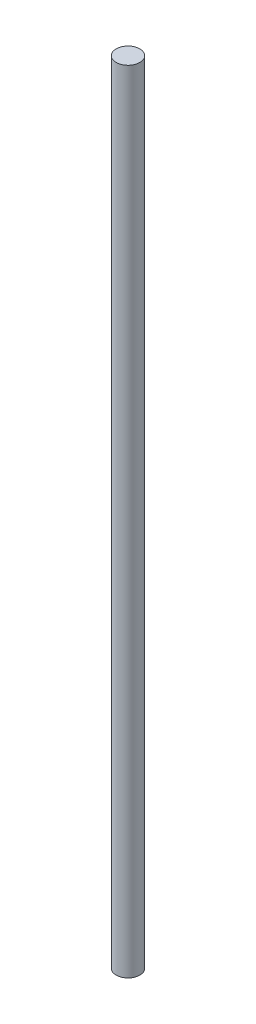
ISO-10303-21;
HEADER;
FILE_DESCRIPTION(('STEP AP214'),'2;1');
FILE_NAME('part.step','',(''),(''),'','','');
FILE_SCHEMA(('AUTOMOTIVE_DESIGN { 1 0 10303 214 1 1 1 1 }'));
ENDSEC;
DATA;
#1=APPLICATION_CONTEXT('core data for automotive mechanical design processes');
#2=APPLICATION_PROTOCOL_DEFINITION('international standard','automotive_design',2000,#1);
#3=PRODUCT_CONTEXT('',#1,'mechanical');
#4=PRODUCT('Part','Part','',(#3));
#5=PRODUCT_RELATED_PRODUCT_CATEGORY('part','',(#4));
#6=PRODUCT_DEFINITION_FORMATION('','',#4);
#7=PRODUCT_DEFINITION_CONTEXT('part definition',#1,'design');
#8=PRODUCT_DEFINITION('design','',#6,#7);
#9=PRODUCT_DEFINITION_SHAPE('','',#8);
#10=(LENGTH_UNIT() NAMED_UNIT(*) SI_UNIT(.MILLI.,.METRE.));
#11=(NAMED_UNIT(*) PLANE_ANGLE_UNIT() SI_UNIT($,.RADIAN.));
#12=(NAMED_UNIT(*) SI_UNIT($,.STERADIAN.) SOLID_ANGLE_UNIT());
#13=UNCERTAINTY_MEASURE_WITH_UNIT(LENGTH_MEASURE(1.E-05),#10,'distance_accuracy_value','');
#14=(GEOMETRIC_REPRESENTATION_CONTEXT(3) GLOBAL_UNCERTAINTY_ASSIGNED_CONTEXT((#13)) GLOBAL_UNIT_ASSIGNED_CONTEXT((#10,
#11,#12)) REPRESENTATION_CONTEXT('',''));
#15=CARTESIAN_POINT('',(0.,0.,0.));
#16=DIRECTION('',(0.,0.,1.));
#17=DIRECTION('',(1.,0.,0.));
#18=AXIS2_PLACEMENT_3D('',#15,#16,#17);
#19=CARTESIAN_POINT('',(0.,100.4,0.));
#20=DIRECTION('',(0.,-1.,0.));
#21=DIRECTION('',(0.,0.,-1.));
#22=AXIS2_PLACEMENT_3D('',#19,#20,#21);
#23=CYLINDRICAL_SURFACE('',#22,1.5);
#24=CARTESIAN_POINT('',(0.,100.4,0.));
#25=DIRECTION('',(0.,1.,0.));
#26=DIRECTION('',(0.,0.,1.));
#27=AXIS2_PLACEMENT_3D('',#24,#25,#26);
#28=CIRCLE('',#27,1.5);
#29=CARTESIAN_POINT('',(0.,100.4,1.5));
#30=VERTEX_POINT('',#29);
#31=EDGE_CURVE('E10',#30,#30,#28,.T.);
#32=ORIENTED_EDGE('',*,*,#31,.F.);
#33=EDGE_LOOP('',(#32));
#34=FACE_BOUND('',#33,.T.);
#35=CARTESIAN_POINT('',(0.,0.,0.));
#36=DIRECTION('',(0.,1.,0.));
#37=DIRECTION('',(0.,0.,1.));
#38=AXIS2_PLACEMENT_3D('',#35,#36,#37);
#39=CIRCLE('',#38,1.5);
#40=CARTESIAN_POINT('',(0.,0.,1.5));
#41=VERTEX_POINT('',#40);
#42=EDGE_CURVE('E40',#41,#41,#39,.T.);
#43=ORIENTED_EDGE('',*,*,#42,.T.);
#44=EDGE_LOOP('',(#43));
#45=FACE_BOUND('',#44,.T.);
#46=ADVANCED_FACE('F37',(#34,#45),#23,.T.);
#47=CARTESIAN_POINT('',(0.,100.4,0.));
#48=DIRECTION('',(0.,1.,0.));
#49=DIRECTION('',(0.,0.,1.));
#50=AXIS2_PLACEMENT_3D('',#47,#48,#49);
#51=PLANE('',#50);
#52=ORIENTED_EDGE('',*,*,#31,.T.);
#53=EDGE_LOOP('',(#52));
#54=FACE_BOUND('',#53,.T.);
#55=ADVANCED_FACE('F54',(#54),#51,.T.);
#56=CARTESIAN_POINT('',(0.,0.,0.));
#57=DIRECTION('',(0.,1.,0.));
#58=DIRECTION('',(0.,0.,1.));
#59=AXIS2_PLACEMENT_3D('',#56,#57,#58);
#60=PLANE('',#59);
#61=ORIENTED_EDGE('',*,*,#42,.F.);
#62=EDGE_LOOP('',(#61));
#63=FACE_BOUND('',#62,.T.);
#64=ADVANCED_FACE('F52',(#63),#60,.F.);
#65=CLOSED_SHELL('',(#46,#55,#64));
#66=MANIFOLD_SOLID_BREP('B2',#65);
#67=ADVANCED_BREP_SHAPE_REPRESENTATION('',(#18,#66),#14);
#68=SHAPE_DEFINITION_REPRESENTATION(#9,#67);
ENDSEC;
END-ISO-10303-21;
